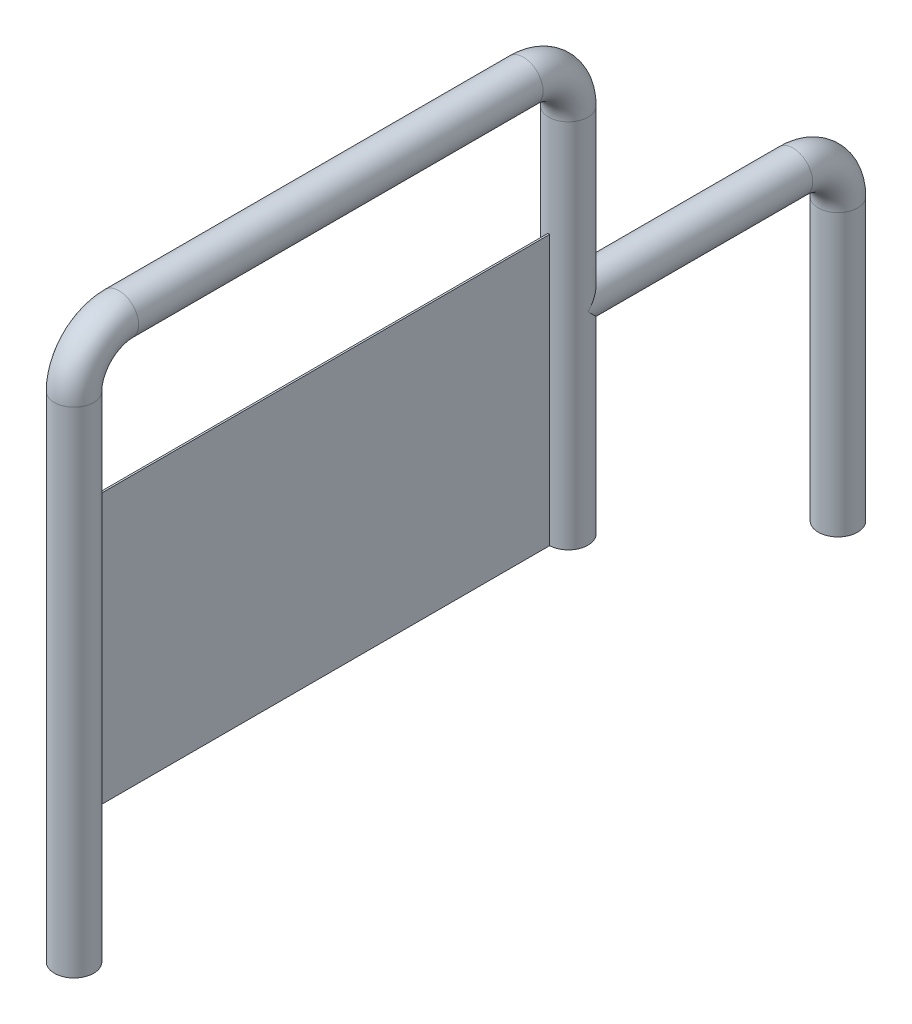
ISO-10303-21;
HEADER;
FILE_DESCRIPTION(('STEP AP214'),'2;1');
FILE_NAME('part.step','',(''),(''),'','','');
FILE_SCHEMA(('AUTOMOTIVE_DESIGN { 1 0 10303 214 1 1 1 1 }'));
ENDSEC;
DATA;
#1=APPLICATION_CONTEXT('core data for automotive mechanical design processes');
#2=APPLICATION_PROTOCOL_DEFINITION('international standard','automotive_design',2000,#1);
#3=PRODUCT_CONTEXT('',#1,'mechanical');
#4=PRODUCT('Part','Part','',(#3));
#5=PRODUCT_RELATED_PRODUCT_CATEGORY('part','',(#4));
#6=PRODUCT_DEFINITION_FORMATION('','',#4);
#7=PRODUCT_DEFINITION_CONTEXT('part definition',#1,'design');
#8=PRODUCT_DEFINITION('design','',#6,#7);
#9=PRODUCT_DEFINITION_SHAPE('','',#8);
#10=(LENGTH_UNIT() NAMED_UNIT(*) SI_UNIT(.MILLI.,.METRE.));
#11=(NAMED_UNIT(*) PLANE_ANGLE_UNIT() SI_UNIT($,.RADIAN.));
#12=(NAMED_UNIT(*) SI_UNIT($,.STERADIAN.) SOLID_ANGLE_UNIT());
#13=UNCERTAINTY_MEASURE_WITH_UNIT(LENGTH_MEASURE(1.E-05),#10,'distance_accuracy_value','');
#14=(GEOMETRIC_REPRESENTATION_CONTEXT(3) GLOBAL_UNCERTAINTY_ASSIGNED_CONTEXT((#13)) GLOBAL_UNIT_ASSIGNED_CONTEXT((#10,
#11,#12)) REPRESENTATION_CONTEXT('',''));
#15=CARTESIAN_POINT('',(0.,0.,0.));
#16=DIRECTION('',(0.,0.,1.));
#17=DIRECTION('',(1.,0.,0.));
#18=AXIS2_PLACEMENT_3D('',#15,#16,#17);
#19=CARTESIAN_POINT('',(-0.508,222.25,-268.2875));
#20=DIRECTION('',(0.,1.,0.));
#21=DIRECTION('',(0.,0.,1.));
#22=AXIS2_PLACEMENT_3D('',#19,#20,#21);
#23=PLANE('',#22);
#24=DIRECTION('',(1.,0.,0.));
#25=VECTOR('',#24,1.);
#26=CARTESIAN_POINT('',(-0.508,222.25,-11.1125));
#27=LINE('',#26,#25);
#28=CARTESIAN_POINT('',(-0.508,222.25,-11.1125));
#29=VERTEX_POINT('',#28);
#30=CARTESIAN_POINT('',(0.508,222.25,-11.1125));
#31=VERTEX_POINT('',#30);
#32=EDGE_CURVE('E46',#29,#31,#27,.T.);
#33=ORIENTED_EDGE('',*,*,#32,.T.);
#34=DIRECTION('',(0.,0.,1.));
#35=VECTOR('',#34,1.);
#36=CARTESIAN_POINT('',(0.508,222.25,-268.2875));
#37=LINE('',#36,#35);
#38=CARTESIAN_POINT('',(0.508,222.25,-268.2875));
#39=VERTEX_POINT('',#38);
#40=EDGE_CURVE('E83',#39,#31,#37,.T.);
#41=ORIENTED_EDGE('',*,*,#40,.F.);
#42=DIRECTION('',(1.,0.,0.));
#43=VECTOR('',#42,1.);
#44=CARTESIAN_POINT('',(-0.508,222.25,-268.2875));
#45=LINE('',#44,#43);
#46=CARTESIAN_POINT('',(-0.508,222.25,-268.2875));
#47=VERTEX_POINT('',#46);
#48=EDGE_CURVE('E13',#47,#39,#45,.T.);
#49=ORIENTED_EDGE('',*,*,#48,.F.);
#50=DIRECTION('',(0.,0.,1.));
#51=VECTOR('',#50,1.);
#52=CARTESIAN_POINT('',(-0.508,222.25,-268.2875));
#53=LINE('',#52,#51);
#54=EDGE_CURVE('E84',#47,#29,#53,.T.);
#55=ORIENTED_EDGE('',*,*,#54,.T.);
#56=EDGE_LOOP('',(#33,#41,#49,#55));
#57=FACE_BOUND('',#56,.T.);
#58=ADVANCED_FACE('F43',(#57),#23,.T.);
#59=CARTESIAN_POINT('',(-0.508,69.8500000000003,-268.2875));
#60=DIRECTION('',(0.,0.,-1.));
#61=DIRECTION('',(-1.,0.,0.));
#62=AXIS2_PLACEMENT_3D('',#59,#60,#61);
#63=PLANE('',#62);
#64=ORIENTED_EDGE('',*,*,#48,.T.);
#65=DIRECTION('',(0.,1.,0.));
#66=VECTOR('',#65,1.);
#67=CARTESIAN_POINT('',(0.508,69.8500000000003,-268.2875));
#68=LINE('',#67,#66);
#69=CARTESIAN_POINT('',(0.508,69.8500000000003,-268.2875));
#70=VERTEX_POINT('',#69);
#71=EDGE_CURVE('E100',#70,#39,#68,.T.);
#72=ORIENTED_EDGE('',*,*,#71,.F.);
#73=DIRECTION('',(1.,0.,0.));
#74=VECTOR('',#73,1.);
#75=CARTESIAN_POINT('',(-0.508,69.8500000000003,-268.2875));
#76=LINE('',#75,#74);
#77=CARTESIAN_POINT('',(-0.508,69.8500000000003,-268.2875));
#78=VERTEX_POINT('',#77);
#79=EDGE_CURVE('E51',#78,#70,#76,.T.);
#80=ORIENTED_EDGE('',*,*,#79,.F.);
#81=DIRECTION('',(0.,1.,0.));
#82=VECTOR('',#81,1.);
#83=CARTESIAN_POINT('',(-0.508,69.8500000000003,-268.2875));
#84=LINE('',#83,#82);
#85=EDGE_CURVE('E89',#78,#47,#84,.T.);
#86=ORIENTED_EDGE('',*,*,#85,.T.);
#87=EDGE_LOOP('',(#64,#72,#80,#86));
#88=FACE_BOUND('',#87,.T.);
#89=ADVANCED_FACE('F115',(#88),#63,.T.);
#90=CARTESIAN_POINT('',(-0.508,69.8500000000003,-268.2875));
#91=DIRECTION('',(0.,-1.,0.));
#92=DIRECTION('',(0.,0.,-1.));
#93=AXIS2_PLACEMENT_3D('',#90,#91,#92);
#94=PLANE('',#93);
#95=ORIENTED_EDGE('',*,*,#79,.T.);
#96=DIRECTION('',(0.,0.,-1.));
#97=VECTOR('',#96,1.);
#98=CARTESIAN_POINT('',(0.508,69.8500000000003,-268.2875));
#99=LINE('',#98,#97);
#100=CARTESIAN_POINT('',(0.508,69.8500000000003,-11.1125));
#101=VERTEX_POINT('',#100);
#102=EDGE_CURVE('E96',#101,#70,#99,.T.);
#103=ORIENTED_EDGE('',*,*,#102,.F.);
#104=DIRECTION('',(1.,0.,0.));
#105=VECTOR('',#104,1.);
#106=CARTESIAN_POINT('',(-0.508,69.8500000000003,-11.1125));
#107=LINE('',#106,#105);
#108=CARTESIAN_POINT('',(-0.508,69.8500000000003,-11.1125));
#109=VERTEX_POINT('',#108);
#110=EDGE_CURVE('E88',#109,#101,#107,.T.);
#111=ORIENTED_EDGE('',*,*,#110,.F.);
#112=DIRECTION('',(0.,0.,-1.));
#113=VECTOR('',#112,1.);
#114=CARTESIAN_POINT('',(-0.508,69.8500000000003,-268.2875));
#115=LINE('',#114,#113);
#116=EDGE_CURVE('E108',#109,#78,#115,.T.);
#117=ORIENTED_EDGE('',*,*,#116,.T.);
#118=EDGE_LOOP('',(#95,#103,#111,#117));
#119=FACE_BOUND('',#118,.T.);
#120=ADVANCED_FACE('F112',(#119),#94,.T.);
#121=CARTESIAN_POINT('',(-0.508,222.25,-11.1125));
#122=DIRECTION('',(0.,0.,1.));
#123=DIRECTION('',(1.,0.,0.));
#124=AXIS2_PLACEMENT_3D('',#121,#122,#123);
#125=PLANE('',#124);
#126=ORIENTED_EDGE('',*,*,#110,.T.);
#127=DIRECTION('',(0.,-1.,0.));
#128=VECTOR('',#127,1.);
#129=CARTESIAN_POINT('',(0.508,222.25,-11.1125));
#130=LINE('',#129,#128);
#131=EDGE_CURVE('E91',#31,#101,#130,.T.);
#132=ORIENTED_EDGE('',*,*,#131,.F.);
#133=ORIENTED_EDGE('',*,*,#32,.F.);
#134=DIRECTION('',(0.,-1.,0.));
#135=VECTOR('',#134,1.);
#136=CARTESIAN_POINT('',(-0.508,222.25,-11.1125));
#137=LINE('',#136,#135);
#138=EDGE_CURVE('E106',#29,#109,#137,.T.);
#139=ORIENTED_EDGE('',*,*,#138,.T.);
#140=EDGE_LOOP('',(#126,#132,#133,#139));
#141=FACE_BOUND('',#140,.T.);
#142=ADVANCED_FACE('F92',(#141),#125,.T.);
#143=CARTESIAN_POINT('',(-0.508,222.25,-11.1125));
#144=DIRECTION('',(1.,0.,0.));
#145=DIRECTION('',(0.,0.,-1.));
#146=AXIS2_PLACEMENT_3D('',#143,#144,#145);
#147=PLANE('',#146);
#148=ORIENTED_EDGE('',*,*,#54,.F.);
#149=ORIENTED_EDGE('',*,*,#85,.F.);
#150=ORIENTED_EDGE('',*,*,#116,.F.);
#151=ORIENTED_EDGE('',*,*,#138,.F.);
#152=EDGE_LOOP('',(#148,#149,#150,#151));
#153=FACE_BOUND('',#152,.T.);
#154=ADVANCED_FACE('F117',(#153),#147,.F.);
#155=CARTESIAN_POINT('',(0.508,222.25,-11.1125));
#156=DIRECTION('',(1.,0.,0.));
#157=DIRECTION('',(0.,0.,-1.));
#158=AXIS2_PLACEMENT_3D('',#155,#156,#157);
#159=PLANE('',#158);
#160=ORIENTED_EDGE('',*,*,#40,.T.);
#161=ORIENTED_EDGE('',*,*,#131,.T.);
#162=ORIENTED_EDGE('',*,*,#102,.T.);
#163=ORIENTED_EDGE('',*,*,#71,.T.);
#164=EDGE_LOOP('',(#160,#161,#162,#163));
#165=FACE_BOUND('',#164,.T.);
#166=ADVANCED_FACE('F99',(#165),#159,.T.);
#167=CLOSED_SHELL('',(#58,#89,#120,#142,#154,#166));
#168=MANIFOLD_SOLID_BREP('B2',#167);
#169=CARTESIAN_POINT('',(0.,158.75,-431.8));
#170=DIRECTION('',(0.,-1.,0.));
#171=DIRECTION('',(0.,0.,-1.));
#172=AXIS2_PLACEMENT_3D('',#169,#170,#171);
#173=CYLINDRICAL_SURFACE('',#172,11.1125);
#174=CARTESIAN_POINT('',(0.,158.75,-431.8));
#175=DIRECTION('',(0.,-1.,0.));
#176=DIRECTION('',(0.,0.,-1.));
#177=AXIS2_PLACEMENT_3D('',#174,#175,#176);
#178=CIRCLE('',#177,11.1125);
#179=CARTESIAN_POINT('',(0.,158.75,-442.9125));
#180=VERTEX_POINT('',#179);
#181=EDGE_CURVE('E174',#180,#180,#178,.T.);
#182=ORIENTED_EDGE('',*,*,#181,.T.);
#183=EDGE_LOOP('',(#182));
#184=FACE_BOUND('',#183,.T.);
#185=CARTESIAN_POINT('',(0.,0.,-431.8));
#186=DIRECTION('',(0.,-1.,0.));
#187=DIRECTION('',(0.,0.,-1.));
#188=AXIS2_PLACEMENT_3D('',#185,#186,#187);
#189=CIRCLE('',#188,11.1125);
#190=CARTESIAN_POINT('',(0.,0.,-442.9125));
#191=VERTEX_POINT('',#190);
#192=EDGE_CURVE('E41',#191,#191,#189,.T.);
#193=ORIENTED_EDGE('',*,*,#192,.F.);
#194=EDGE_LOOP('',(#193));
#195=FACE_BOUND('',#194,.T.);
#196=ADVANCED_FACE('F167',(#184,#195),#173,.T.);
#197=CARTESIAN_POINT('',(0.,158.75,-406.4));
#198=DIRECTION('',(-1.,0.,0.));
#199=DIRECTION('',(0.,0.,1.));
#200=AXIS2_PLACEMENT_3D('',#197,#198,#199);
#201=TOROIDAL_SURFACE('',#200,25.4,11.1125);
#202=CARTESIAN_POINT('',(0.,184.15,-406.4));
#203=DIRECTION('',(0.,0.,-1.));
#204=DIRECTION('',(0.,1.,0.));
#205=AXIS2_PLACEMENT_3D('',#202,#203,#204);
#206=CIRCLE('',#205,11.1125);
#207=CARTESIAN_POINT('',(0.,195.2625,-406.4));
#208=VERTEX_POINT('',#207);
#209=EDGE_CURVE('E191',#208,#208,#206,.T.);
#210=CARTESIAN_POINT('',(0.,158.75,-406.4));
#211=DIRECTION('',(-1.,0.,0.));
#212=DIRECTION('',(0.,0.,1.));
#213=AXIS2_PLACEMENT_3D('',#210,#211,#212);
#214=CIRCLE('',#213,36.5125);
#215=EDGE_CURVE('',#208,#180,#214,.T.);
#216=ORIENTED_EDGE('',*,*,#209,.T.);
#217=ORIENTED_EDGE('',*,*,#181,.F.);
#218=ORIENTED_EDGE('',*,*,#215,.T.);
#219=ORIENTED_EDGE('',*,*,#215,.F.);
#220=EDGE_LOOP('',(#216,#218,#217,#219));
#221=FACE_BOUND('',#220,.T.);
#222=ADVANCED_FACE('F205',(#221),#201,.T.);
#223=CARTESIAN_POINT('',(0.,184.15,-279.4));
#224=DIRECTION('',(0.,0.,-1.));
#225=DIRECTION('',(-1.,0.,0.));
#226=AXIS2_PLACEMENT_3D('',#223,#224,#225);
#227=CYLINDRICAL_SURFACE('',#226,11.1125);
#228=CARTESIAN_POINT('',(0.,184.15,-279.4));
#229=DIRECTION('',(0.,-0.707106781186548,-0.707106781186548));
#230=DIRECTION('',(0.,-0.707106781186548,0.707106781186548));
#231=AXIS2_PLACEMENT_3D('',#228,#229,#230);
#232=ELLIPSE('',#231,15.715448211871,11.1125);
#233=CARTESIAN_POINT('',(11.1125,184.15,-279.4));
#234=VERTEX_POINT('',#233);
#235=CARTESIAN_POINT('',(-11.1125,184.15,-279.4));
#236=VERTEX_POINT('',#235);
#237=EDGE_CURVE('E185',#234,#236,#232,.F.);
#238=ORIENTED_EDGE('',*,*,#237,.F.);
#239=CARTESIAN_POINT('',(0.,184.15,-279.4));
#240=DIRECTION('',(0.,0.707106781186547,-0.707106781186547));
#241=DIRECTION('',(0.,-0.707106781186547,-0.707106781186547));
#242=AXIS2_PLACEMENT_3D('',#239,#240,#241);
#243=ELLIPSE('',#242,15.715448211871,11.1125);
#244=EDGE_CURVE('E180',#234,#236,#243,.T.);
#245=ORIENTED_EDGE('',*,*,#244,.T.);
#246=EDGE_LOOP('',(#238,#245));
#247=FACE_BOUND('',#246,.T.);
#248=ORIENTED_EDGE('',*,*,#209,.F.);
#249=EDGE_LOOP('',(#248));
#250=FACE_BOUND('',#249,.T.);
#251=ADVANCED_FACE('F189',(#247,#250),#227,.T.);
#252=CARTESIAN_POINT('',(0.,279.4,-279.4));
#253=DIRECTION('',(0.,-1.,0.));
#254=DIRECTION('',(0.,0.,-1.));
#255=AXIS2_PLACEMENT_3D('',#252,#253,#254);
#256=CYLINDRICAL_SURFACE('',#255,11.1125);
#257=CARTESIAN_POINT('',(0.,279.4,-279.4));
#258=DIRECTION('',(0.,-1.,0.));
#259=DIRECTION('',(0.,0.,-1.));
#260=AXIS2_PLACEMENT_3D('',#257,#258,#259);
#261=CIRCLE('',#260,11.1125);
#262=CARTESIAN_POINT('',(0.,279.4,-290.5125));
#263=VERTEX_POINT('',#262);
#264=EDGE_CURVE('E192',#263,#263,#261,.T.);
#265=ORIENTED_EDGE('',*,*,#264,.T.);
#266=EDGE_LOOP('',(#265));
#267=FACE_BOUND('',#266,.T.);
#268=ORIENTED_EDGE('',*,*,#237,.T.);
#269=ORIENTED_EDGE('',*,*,#244,.F.);
#270=EDGE_LOOP('',(#268,#269));
#271=FACE_BOUND('',#270,.T.);
#272=CARTESIAN_POINT('',(0.,69.85,-279.4));
#273=DIRECTION('',(0.,-1.,0.));
#274=DIRECTION('',(0.,0.,-1.));
#275=AXIS2_PLACEMENT_3D('',#272,#273,#274);
#276=CIRCLE('',#275,11.1125);
#277=CARTESIAN_POINT('',(0.,69.8499999999996,-290.5125));
#278=VERTEX_POINT('',#277);
#279=EDGE_CURVE('E187',#278,#278,#276,.T.);
#280=ORIENTED_EDGE('',*,*,#279,.F.);
#281=EDGE_LOOP('',(#280));
#282=FACE_BOUND('',#281,.T.);
#283=ADVANCED_FACE('F183',(#267,#271,#282),#256,.T.);
#284=CARTESIAN_POINT('',(0.,279.4,-254.));
#285=DIRECTION('',(-1.,0.,0.));
#286=DIRECTION('',(0.,0.,1.));
#287=AXIS2_PLACEMENT_3D('',#284,#285,#286);
#288=TOROIDAL_SURFACE('',#287,25.4,11.1125);
#289=CARTESIAN_POINT('',(0.,304.8,-254.));
#290=DIRECTION('',(0.,0.,-1.));
#291=DIRECTION('',(0.,1.,0.));
#292=AXIS2_PLACEMENT_3D('',#289,#290,#291);
#293=CIRCLE('',#292,11.1125);
#294=CARTESIAN_POINT('',(0.,315.9125,-254.));
#295=VERTEX_POINT('',#294);
#296=EDGE_CURVE('E197',#295,#295,#293,.T.);
#297=CARTESIAN_POINT('',(0.,279.4,-254.));
#298=DIRECTION('',(-1.,0.,0.));
#299=DIRECTION('',(0.,0.,1.));
#300=AXIS2_PLACEMENT_3D('',#297,#298,#299);
#301=CIRCLE('',#300,36.5125);
#302=EDGE_CURVE('',#295,#263,#301,.T.);
#303=ORIENTED_EDGE('',*,*,#296,.T.);
#304=ORIENTED_EDGE('',*,*,#264,.F.);
#305=ORIENTED_EDGE('',*,*,#302,.T.);
#306=ORIENTED_EDGE('',*,*,#302,.F.);
#307=EDGE_LOOP('',(#303,#305,#304,#306));
#308=FACE_BOUND('',#307,.T.);
#309=ADVANCED_FACE('F216',(#308),#288,.T.);
#310=CARTESIAN_POINT('',(0.,304.8,-25.4000000000002));
#311=DIRECTION('',(0.,0.,-1.));
#312=DIRECTION('',(-1.,0.,0.));
#313=AXIS2_PLACEMENT_3D('',#310,#311,#312);
#314=CYLINDRICAL_SURFACE('',#313,11.1125);
#315=CARTESIAN_POINT('',(0.,304.8,-25.4000000000002));
#316=DIRECTION('',(0.,0.,-1.));
#317=DIRECTION('',(0.,1.,0.));
#318=AXIS2_PLACEMENT_3D('',#315,#316,#317);
#319=CIRCLE('',#318,11.1125);
#320=CARTESIAN_POINT('',(0.,315.9125,-25.4000000000003));
#321=VERTEX_POINT('',#320);
#322=EDGE_CURVE('E253',#321,#321,#319,.T.);
#323=ORIENTED_EDGE('',*,*,#322,.T.);
#324=EDGE_LOOP('',(#323));
#325=FACE_BOUND('',#324,.T.);
#326=ORIENTED_EDGE('',*,*,#296,.F.);
#327=EDGE_LOOP('',(#326));
#328=FACE_BOUND('',#327,.T.);
#329=ADVANCED_FACE('F220',(#325,#328),#314,.T.);
#330=CARTESIAN_POINT('',(0.,279.4,-25.4));
#331=DIRECTION('',(-1.,0.,0.));
#332=DIRECTION('',(0.,0.,1.));
#333=AXIS2_PLACEMENT_3D('',#330,#331,#332);
#334=TOROIDAL_SURFACE('',#333,25.4,11.1125);
#335=CARTESIAN_POINT('',(0.,279.4,0.));
#336=DIRECTION('',(0.,1.,0.));
#337=DIRECTION('',(0.,0.,1.));
#338=AXIS2_PLACEMENT_3D('',#335,#336,#337);
#339=CIRCLE('',#338,11.1125);
#340=CARTESIAN_POINT('',(0.,279.4,11.1125));
#341=VERTEX_POINT('',#340);
#342=EDGE_CURVE('E250',#341,#341,#339,.T.);
#343=CARTESIAN_POINT('',(0.,279.4,-25.4));
#344=DIRECTION('',(-1.,0.,0.));
#345=DIRECTION('',(0.,0.,1.));
#346=AXIS2_PLACEMENT_3D('',#343,#344,#345);
#347=CIRCLE('',#346,36.5125);
#348=EDGE_CURVE('',#341,#321,#347,.T.);
#349=ORIENTED_EDGE('',*,*,#342,.T.);
#350=ORIENTED_EDGE('',*,*,#322,.F.);
#351=ORIENTED_EDGE('',*,*,#348,.T.);
#352=ORIENTED_EDGE('',*,*,#348,.F.);
#353=EDGE_LOOP('',(#349,#351,#350,#352));
#354=FACE_BOUND('',#353,.T.);
#355=ADVANCED_FACE('F224',(#354),#334,.T.);
#356=CARTESIAN_POINT('',(0.,279.4,0.));
#357=DIRECTION('',(0.,-1.,0.));
#358=DIRECTION('',(0.,0.,-1.));
#359=AXIS2_PLACEMENT_3D('',#356,#357,#358);
#360=CYLINDRICAL_SURFACE('',#359,11.1125);
#361=ORIENTED_EDGE('',*,*,#342,.F.);
#362=EDGE_LOOP('',(#361));
#363=FACE_BOUND('',#362,.T.);
#364=CARTESIAN_POINT('',(0.,0.,0.));
#365=DIRECTION('',(0.,1.,0.));
#366=DIRECTION('',(0.,0.,1.));
#367=AXIS2_PLACEMENT_3D('',#364,#365,#366);
#368=CIRCLE('',#367,11.1125);
#369=CARTESIAN_POINT('',(0.,0.,11.1125));
#370=VERTEX_POINT('',#369);
#371=EDGE_CURVE('E186',#370,#370,#368,.T.);
#372=ORIENTED_EDGE('',*,*,#371,.T.);
#373=EDGE_LOOP('',(#372));
#374=FACE_BOUND('',#373,.T.);
#375=ADVANCED_FACE('F228',(#363,#374),#360,.T.);
#376=CARTESIAN_POINT('',(0.,0.,0.));
#377=DIRECTION('',(0.,1.,0.));
#378=DIRECTION('',(0.,0.,1.));
#379=AXIS2_PLACEMENT_3D('',#376,#377,#378);
#380=PLANE('',#379);
#381=ORIENTED_EDGE('',*,*,#371,.F.);
#382=EDGE_LOOP('',(#381));
#383=FACE_BOUND('',#382,.T.);
#384=ADVANCED_FACE('F232',(#383),#380,.F.);
#385=CARTESIAN_POINT('',(0.,0.,-431.8));
#386=DIRECTION('',(0.,-1.,0.));
#387=DIRECTION('',(0.,0.,-1.));
#388=AXIS2_PLACEMENT_3D('',#385,#386,#387);
#389=PLANE('',#388);
#390=ORIENTED_EDGE('',*,*,#192,.T.);
#391=EDGE_LOOP('',(#390));
#392=FACE_BOUND('',#391,.T.);
#393=ADVANCED_FACE('F236',(#392),#389,.T.);
#394=CARTESIAN_POINT('',(0.,69.85,-279.4));
#395=DIRECTION('',(0.,-1.,0.));
#396=DIRECTION('',(0.,0.,-1.));
#397=AXIS2_PLACEMENT_3D('',#394,#395,#396);
#398=PLANE('',#397);
#399=ORIENTED_EDGE('',*,*,#279,.T.);
#400=EDGE_LOOP('',(#399));
#401=FACE_BOUND('',#400,.T.);
#402=ADVANCED_FACE('F240',(#401),#398,.T.);
#403=CLOSED_SHELL('',(#196,#222,#251,#283,#309,#329,#355,#375,#384,#393,#402));
#404=MANIFOLD_SOLID_BREP('B7',#403);
#405=ADVANCED_BREP_SHAPE_REPRESENTATION('',(#18,#168,#404),#14);
#406=SHAPE_DEFINITION_REPRESENTATION(#9,#405);
ENDSEC;
END-ISO-10303-21;
